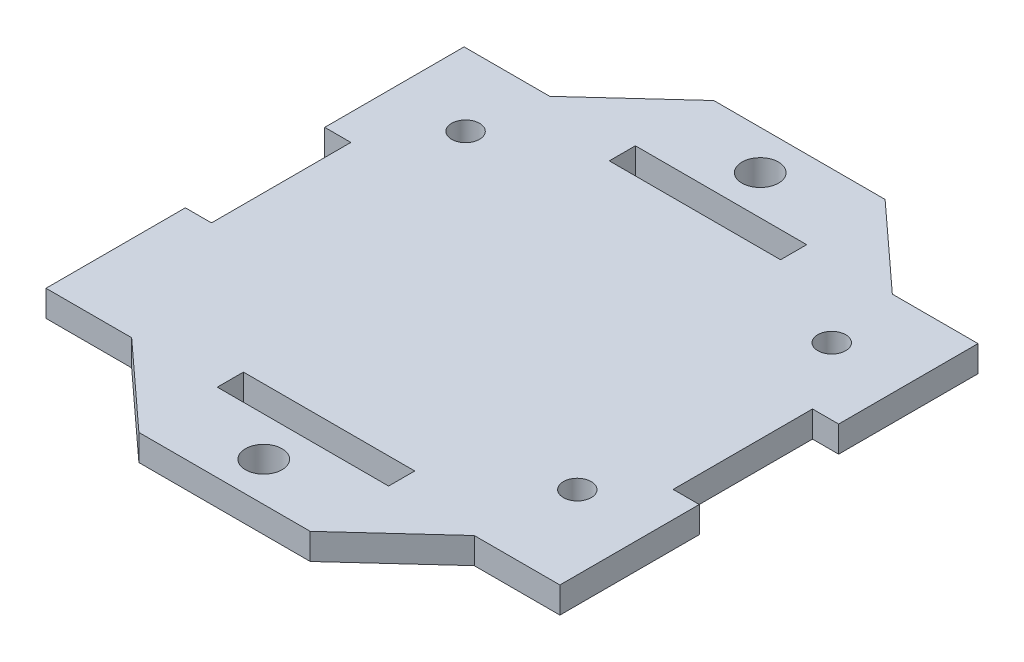
ISO-10303-21;
HEADER;
FILE_DESCRIPTION(('STEP AP214'),'2;1');
FILE_NAME('part.step','',(''),(''),'','','');
FILE_SCHEMA(('AUTOMOTIVE_DESIGN { 1 0 10303 214 1 1 1 1 }'));
ENDSEC;
DATA;
#1=APPLICATION_CONTEXT('core data for automotive mechanical design processes');
#2=APPLICATION_PROTOCOL_DEFINITION('international standard','automotive_design',2000,#1);
#3=PRODUCT_CONTEXT('',#1,'mechanical');
#4=PRODUCT('Part','Part','',(#3));
#5=PRODUCT_RELATED_PRODUCT_CATEGORY('part','',(#4));
#6=PRODUCT_DEFINITION_FORMATION('','',#4);
#7=PRODUCT_DEFINITION_CONTEXT('part definition',#1,'design');
#8=PRODUCT_DEFINITION('design','',#6,#7);
#9=PRODUCT_DEFINITION_SHAPE('','',#8);
#10=(LENGTH_UNIT() NAMED_UNIT(*) SI_UNIT(.MILLI.,.METRE.));
#11=(NAMED_UNIT(*) PLANE_ANGLE_UNIT() SI_UNIT($,.RADIAN.));
#12=(NAMED_UNIT(*) SI_UNIT($,.STERADIAN.) SOLID_ANGLE_UNIT());
#13=UNCERTAINTY_MEASURE_WITH_UNIT(LENGTH_MEASURE(1.E-05),#10,'distance_accuracy_value','');
#14=(GEOMETRIC_REPRESENTATION_CONTEXT(3) GLOBAL_UNCERTAINTY_ASSIGNED_CONTEXT((#13)) GLOBAL_UNIT_ASSIGNED_CONTEXT((#10,
#11,#12)) REPRESENTATION_CONTEXT('',''));
#15=CARTESIAN_POINT('',(0.,0.,0.));
#16=DIRECTION('',(0.,0.,1.));
#17=DIRECTION('',(1.,0.,0.));
#18=AXIS2_PLACEMENT_3D('',#15,#16,#17);
#19=CARTESIAN_POINT('',(-29.5,3.,24.));
#20=DIRECTION('',(0.,0.,-1.));
#21=DIRECTION('',(-1.,0.,0.));
#22=AXIS2_PLACEMENT_3D('',#19,#20,#21);
#23=PLANE('',#22);
#24=DIRECTION('',(0.,1.,0.));
#25=VECTOR('',#24,1.);
#26=CARTESIAN_POINT('',(-19.6666666666667,0.,24.));
#27=LINE('',#26,#25);
#28=CARTESIAN_POINT('',(-19.6666666666667,0.,24.));
#29=VERTEX_POINT('',#28);
#30=CARTESIAN_POINT('',(-19.6666666666667,3.,24.));
#31=VERTEX_POINT('',#30);
#32=EDGE_CURVE('E233',#29,#31,#27,.T.);
#33=ORIENTED_EDGE('',*,*,#32,.T.);
#34=DIRECTION('',(1.,0.,0.));
#35=VECTOR('',#34,1.);
#36=CARTESIAN_POINT('',(-29.5,3.,24.));
#37=LINE('',#36,#35);
#38=CARTESIAN_POINT('',(-29.5,3.,24.));
#39=VERTEX_POINT('',#38);
#40=EDGE_CURVE('E362',#39,#31,#37,.T.);
#41=ORIENTED_EDGE('',*,*,#40,.F.);
#42=DIRECTION('',(0.,-1.,0.));
#43=VECTOR('',#42,1.);
#44=CARTESIAN_POINT('',(-29.5,3.,24.));
#45=LINE('',#44,#43);
#46=CARTESIAN_POINT('',(-29.5,0.,24.));
#47=VERTEX_POINT('',#46);
#48=EDGE_CURVE('E245',#39,#47,#45,.T.);
#49=ORIENTED_EDGE('',*,*,#48,.T.);
#50=DIRECTION('',(1.,0.,0.));
#51=VECTOR('',#50,1.);
#52=CARTESIAN_POINT('',(-29.5,0.,24.));
#53=LINE('',#52,#51);
#54=EDGE_CURVE('E224',#47,#29,#53,.T.);
#55=ORIENTED_EDGE('',*,*,#54,.T.);
#56=EDGE_LOOP('',(#33,#41,#49,#55));
#57=FACE_BOUND('',#56,.T.);
#58=ADVANCED_FACE('F32',(#57),#23,.F.);
#59=CARTESIAN_POINT('',(9.83333333333333,3.,24.));
#60=DIRECTION('',(0.,0.,-1.));
#61=DIRECTION('',(-1.,0.,0.));
#62=AXIS2_PLACEMENT_3D('',#59,#60,#61);
#63=PLANE('',#62);
#64=DIRECTION('',(0.,1.,0.));
#65=VECTOR('',#64,1.);
#66=CARTESIAN_POINT('',(19.6666666666667,0.,24.));
#67=LINE('',#66,#65);
#68=CARTESIAN_POINT('',(19.6666666666667,0.,24.));
#69=VERTEX_POINT('',#68);
#70=CARTESIAN_POINT('',(19.6666666666667,3.,24.));
#71=VERTEX_POINT('',#70);
#72=EDGE_CURVE('E47',#69,#71,#67,.T.);
#73=ORIENTED_EDGE('',*,*,#72,.F.);
#74=DIRECTION('',(1.,0.,0.));
#75=VECTOR('',#74,1.);
#76=CARTESIAN_POINT('',(9.83333333333333,0.,24.));
#77=LINE('',#76,#75);
#78=CARTESIAN_POINT('',(29.5,0.,24.));
#79=VERTEX_POINT('',#78);
#80=EDGE_CURVE('E258',#69,#79,#77,.T.);
#81=ORIENTED_EDGE('',*,*,#80,.T.);
#82=DIRECTION('',(0.,-1.,0.));
#83=VECTOR('',#82,1.);
#84=CARTESIAN_POINT('',(29.5,3.,24.));
#85=LINE('',#84,#83);
#86=CARTESIAN_POINT('',(29.5,3.,24.));
#87=VERTEX_POINT('',#86);
#88=EDGE_CURVE('E307',#87,#79,#85,.T.);
#89=ORIENTED_EDGE('',*,*,#88,.F.);
#90=DIRECTION('',(1.,0.,0.));
#91=VECTOR('',#90,1.);
#92=CARTESIAN_POINT('',(9.83333333333333,3.,24.));
#93=LINE('',#92,#91);
#94=EDGE_CURVE('E376',#71,#87,#93,.T.);
#95=ORIENTED_EDGE('',*,*,#94,.F.);
#96=EDGE_LOOP('',(#73,#81,#89,#95));
#97=FACE_BOUND('',#96,.T.);
#98=ADVANCED_FACE('F427',(#97),#63,.F.);
#99=CARTESIAN_POINT('',(0.,3.,0.));
#100=DIRECTION('',(0.,1.,0.));
#101=DIRECTION('',(0.,0.,1.));
#102=AXIS2_PLACEMENT_3D('',#99,#100,#101);
#103=PLANE('',#102);
#104=DIRECTION('',(1.,0.,0.));
#105=VECTOR('',#104,1.);
#106=CARTESIAN_POINT('',(-19.6666666666667,3.,24.));
#107=LINE('',#106,#105);
#108=CARTESIAN_POINT('',(-9.83333333333333,3.,24.));
#109=VERTEX_POINT('',#108);
#110=CARTESIAN_POINT('',(9.83333333333333,3.,24.));
#111=VERTEX_POINT('',#110);
#112=EDGE_CURVE('E464',#109,#111,#107,.T.);
#113=ORIENTED_EDGE('',*,*,#112,.F.);
#114=DIRECTION('',(0.,0.,-1.));
#115=VECTOR('',#114,1.);
#116=CARTESIAN_POINT('',(-9.83333333333333,3.,24.));
#117=LINE('',#116,#115);
#118=CARTESIAN_POINT('',(-9.83333333333333,3.,21.));
#119=VERTEX_POINT('',#118);
#120=EDGE_CURVE('E365',#109,#119,#117,.T.);
#121=ORIENTED_EDGE('',*,*,#120,.T.);
#122=DIRECTION('',(1.,0.,0.));
#123=VECTOR('',#122,1.);
#124=CARTESIAN_POINT('',(-9.83333333333333,3.,21.));
#125=LINE('',#124,#123);
#126=CARTESIAN_POINT('',(9.83333333333333,3.,21.));
#127=VERTEX_POINT('',#126);
#128=EDGE_CURVE('E372',#119,#127,#125,.T.);
#129=ORIENTED_EDGE('',*,*,#128,.T.);
#130=DIRECTION('',(0.,0.,1.));
#131=VECTOR('',#130,1.);
#132=CARTESIAN_POINT('',(9.83333333333333,3.,21.));
#133=LINE('',#132,#131);
#134=EDGE_CURVE('E374',#127,#111,#133,.T.);
#135=ORIENTED_EDGE('',*,*,#134,.T.);
#136=EDGE_LOOP('',(#113,#121,#129,#135));
#137=FACE_BOUND('',#136,.T.);
#138=DIRECTION('',(-0.737672912354375,0.,0.675158258765021));
#139=VECTOR('',#138,1.);
#140=CARTESIAN_POINT('',(-19.6666666666667,3.,-24.));
#141=LINE('',#140,#139);
#142=CARTESIAN_POINT('',(-9.83333333333333,3.,-33.));
#143=VERTEX_POINT('',#142);
#144=CARTESIAN_POINT('',(-19.6666666666667,3.,-24.));
#145=VERTEX_POINT('',#144);
#146=EDGE_CURVE('E494',#143,#145,#141,.T.);
#147=ORIENTED_EDGE('',*,*,#146,.T.);
#148=DIRECTION('',(-1.,0.,0.));
#149=VECTOR('',#148,1.);
#150=CARTESIAN_POINT('',(-9.83333333333333,3.,-24.));
#151=LINE('',#150,#149);
#152=CARTESIAN_POINT('',(-29.5,3.,-24.));
#153=VERTEX_POINT('',#152);
#154=EDGE_CURVE('E55',#145,#153,#151,.T.);
#155=ORIENTED_EDGE('',*,*,#154,.T.);
#156=DIRECTION('',(0.,0.,1.));
#157=VECTOR('',#156,1.);
#158=CARTESIAN_POINT('',(-29.5,3.,-24.));
#159=LINE('',#158,#157);
#160=CARTESIAN_POINT('',(-29.5,3.,-8.));
#161=VERTEX_POINT('',#160);
#162=EDGE_CURVE('E409',#153,#161,#159,.T.);
#163=ORIENTED_EDGE('',*,*,#162,.T.);
#164=DIRECTION('',(1.,0.,0.));
#165=VECTOR('',#164,1.);
#166=CARTESIAN_POINT('',(-29.5,3.,-8.));
#167=LINE('',#166,#165);
#168=CARTESIAN_POINT('',(-26.5,3.,-8.));
#169=VERTEX_POINT('',#168);
#170=EDGE_CURVE('E339',#161,#169,#167,.T.);
#171=ORIENTED_EDGE('',*,*,#170,.T.);
#172=DIRECTION('',(0.,0.,1.));
#173=VECTOR('',#172,1.);
#174=CARTESIAN_POINT('',(-26.5,3.,-8.));
#175=LINE('',#174,#173);
#176=CARTESIAN_POINT('',(-26.5,3.,8.));
#177=VERTEX_POINT('',#176);
#178=EDGE_CURVE('E367',#169,#177,#175,.T.);
#179=ORIENTED_EDGE('',*,*,#178,.T.);
#180=DIRECTION('',(-1.,0.,0.));
#181=VECTOR('',#180,1.);
#182=CARTESIAN_POINT('',(-26.5,3.,8.));
#183=LINE('',#182,#181);
#184=CARTESIAN_POINT('',(-29.5,3.,8.));
#185=VERTEX_POINT('',#184);
#186=EDGE_CURVE('E363',#177,#185,#183,.T.);
#187=ORIENTED_EDGE('',*,*,#186,.T.);
#188=DIRECTION('',(0.,0.,1.));
#189=VECTOR('',#188,1.);
#190=CARTESIAN_POINT('',(-29.5,3.,8.));
#191=LINE('',#190,#189);
#192=EDGE_CURVE('E360',#185,#39,#191,.T.);
#193=ORIENTED_EDGE('',*,*,#192,.T.);
#194=ORIENTED_EDGE('',*,*,#40,.T.);
#195=DIRECTION('',(-0.737672912354375,0.,-0.675158258765021));
#196=VECTOR('',#195,1.);
#197=CARTESIAN_POINT('',(-19.6666666666667,3.,24.));
#198=LINE('',#197,#196);
#199=CARTESIAN_POINT('',(-9.83333333333333,3.,33.));
#200=VERTEX_POINT('',#199);
#201=EDGE_CURVE('E236',#200,#31,#198,.T.);
#202=ORIENTED_EDGE('',*,*,#201,.F.);
#203=DIRECTION('',(-1.,0.,0.));
#204=VECTOR('',#203,1.);
#205=CARTESIAN_POINT('',(-9.83333333333333,3.,33.));
#206=LINE('',#205,#204);
#207=CARTESIAN_POINT('',(9.83333333333334,3.,33.));
#208=VERTEX_POINT('',#207);
#209=EDGE_CURVE('E468',#208,#200,#206,.T.);
#210=ORIENTED_EDGE('',*,*,#209,.F.);
#211=DIRECTION('',(-0.737672912354375,0.,0.675158258765021));
#212=VECTOR('',#211,1.);
#213=CARTESIAN_POINT('',(9.83333333333334,3.,33.));
#214=LINE('',#213,#212);
#215=EDGE_CURVE('E477',#71,#208,#214,.T.);
#216=ORIENTED_EDGE('',*,*,#215,.F.);
#217=ORIENTED_EDGE('',*,*,#94,.T.);
#218=DIRECTION('',(0.,0.,-1.));
#219=VECTOR('',#218,1.);
#220=CARTESIAN_POINT('',(29.5,3.,24.));
#221=LINE('',#220,#219);
#222=CARTESIAN_POINT('',(29.5,3.,8.));
#223=VERTEX_POINT('',#222);
#224=EDGE_CURVE('E378',#87,#223,#221,.T.);
#225=ORIENTED_EDGE('',*,*,#224,.T.);
#226=DIRECTION('',(-1.,0.,0.));
#227=VECTOR('',#226,1.);
#228=CARTESIAN_POINT('',(29.5,3.,8.));
#229=LINE('',#228,#227);
#230=CARTESIAN_POINT('',(26.5,3.,8.));
#231=VERTEX_POINT('',#230);
#232=EDGE_CURVE('E380',#223,#231,#229,.T.);
#233=ORIENTED_EDGE('',*,*,#232,.T.);
#234=DIRECTION('',(0.,0.,-1.));
#235=VECTOR('',#234,1.);
#236=CARTESIAN_POINT('',(26.5,3.,8.));
#237=LINE('',#236,#235);
#238=CARTESIAN_POINT('',(26.5,3.,-7.99999999999999));
#239=VERTEX_POINT('',#238);
#240=EDGE_CURVE('E382',#231,#239,#237,.T.);
#241=ORIENTED_EDGE('',*,*,#240,.T.);
#242=DIRECTION('',(1.,0.,0.));
#243=VECTOR('',#242,1.);
#244=CARTESIAN_POINT('',(26.5,3.,-7.99999999999999));
#245=LINE('',#244,#243);
#246=CARTESIAN_POINT('',(29.5,3.,-7.99999999999999));
#247=VERTEX_POINT('',#246);
#248=EDGE_CURVE('E384',#239,#247,#245,.T.);
#249=ORIENTED_EDGE('',*,*,#248,.T.);
#250=DIRECTION('',(0.,0.,-1.));
#251=VECTOR('',#250,1.);
#252=CARTESIAN_POINT('',(29.5,3.,-7.99999999999999));
#253=LINE('',#252,#251);
#254=CARTESIAN_POINT('',(29.5,3.,-24.));
#255=VERTEX_POINT('',#254);
#256=EDGE_CURVE('E386',#247,#255,#253,.T.);
#257=ORIENTED_EDGE('',*,*,#256,.T.);
#258=DIRECTION('',(-1.,0.,0.));
#259=VECTOR('',#258,1.);
#260=CARTESIAN_POINT('',(29.5,3.,-24.));
#261=LINE('',#260,#259);
#262=CARTESIAN_POINT('',(19.6666666666667,3.,-24.));
#263=VERTEX_POINT('',#262);
#264=EDGE_CURVE('E388',#255,#263,#261,.T.);
#265=ORIENTED_EDGE('',*,*,#264,.T.);
#266=DIRECTION('',(-0.737672912354375,0.,-0.675158258765021));
#267=VECTOR('',#266,1.);
#268=CARTESIAN_POINT('',(9.83333333333334,3.,-33.));
#269=LINE('',#268,#267);
#270=CARTESIAN_POINT('',(9.83333333333334,3.,-33.));
#271=VERTEX_POINT('',#270);
#272=EDGE_CURVE('E506',#263,#271,#269,.T.);
#273=ORIENTED_EDGE('',*,*,#272,.T.);
#274=DIRECTION('',(-1.,0.,0.));
#275=VECTOR('',#274,1.);
#276=CARTESIAN_POINT('',(-9.83333333333333,3.,-33.));
#277=LINE('',#276,#275);
#278=EDGE_CURVE('E509',#271,#143,#277,.T.);
#279=ORIENTED_EDGE('',*,*,#278,.T.);
#280=EDGE_LOOP('',(#147,#155,#163,#171,#179,#187,#193,#194,#202,#210,#216,#217,#225,#233,#241,
#249,#257,#265,#273,#279));
#281=FACE_BOUND('',#280,.T.);
#282=CARTESIAN_POINT('',(21.0185,3.,-15.69));
#283=DIRECTION('',(0.,1.,0.));
#284=DIRECTION('',(0.,0.,1.));
#285=AXIS2_PLACEMENT_3D('',#282,#283,#284);
#286=CIRCLE('',#285,1.6);
#287=CARTESIAN_POINT('',(21.0185,3.,-14.09));
#288=VERTEX_POINT('',#287);
#289=EDGE_CURVE('E402',#288,#288,#286,.T.);
#290=ORIENTED_EDGE('',*,*,#289,.F.);
#291=EDGE_LOOP('',(#290));
#292=FACE_BOUND('',#291,.T.);
#293=DIRECTION('',(0.,0.,-1.));
#294=VECTOR('',#293,1.);
#295=CARTESIAN_POINT('',(-9.83333333333333,3.,-21.));
#296=LINE('',#295,#294);
#297=CARTESIAN_POINT('',(-9.83333333333333,3.,-21.));
#298=VERTEX_POINT('',#297);
#299=CARTESIAN_POINT('',(-9.83333333333333,3.,-24.));
#300=VERTEX_POINT('',#299);
#301=EDGE_CURVE('E283',#298,#300,#296,.T.);
#302=ORIENTED_EDGE('',*,*,#301,.T.);
#303=DIRECTION('',(1.,0.,0.));
#304=VECTOR('',#303,1.);
#305=CARTESIAN_POINT('',(-19.6666666666667,3.,-24.));
#306=LINE('',#305,#304);
#307=CARTESIAN_POINT('',(9.83333333333334,3.,-24.));
#308=VERTEX_POINT('',#307);
#309=EDGE_CURVE('E488',#300,#308,#306,.T.);
#310=ORIENTED_EDGE('',*,*,#309,.T.);
#311=DIRECTION('',(0.,0.,1.));
#312=VECTOR('',#311,1.);
#313=CARTESIAN_POINT('',(9.83333333333334,3.,-24.));
#314=LINE('',#313,#312);
#315=CARTESIAN_POINT('',(9.83333333333334,3.,-21.));
#316=VERTEX_POINT('',#315);
#317=EDGE_CURVE('E391',#308,#316,#314,.T.);
#318=ORIENTED_EDGE('',*,*,#317,.T.);
#319=DIRECTION('',(-1.,0.,0.));
#320=VECTOR('',#319,1.);
#321=CARTESIAN_POINT('',(9.83333333333334,3.,-21.));
#322=LINE('',#321,#320);
#323=EDGE_CURVE('E393',#316,#298,#322,.T.);
#324=ORIENTED_EDGE('',*,*,#323,.T.);
#325=EDGE_LOOP('',(#302,#310,#318,#324));
#326=FACE_BOUND('',#325,.T.);
#327=CARTESIAN_POINT('',(-21.0185,3.,-15.69));
#328=DIRECTION('',(0.,1.,0.));
#329=DIRECTION('',(0.,0.,1.));
#330=AXIS2_PLACEMENT_3D('',#327,#328,#329);
#331=CIRCLE('',#330,1.6);
#332=CARTESIAN_POINT('',(-21.0185,3.,-14.09));
#333=VERTEX_POINT('',#332);
#334=EDGE_CURVE('E395',#333,#333,#331,.T.);
#335=ORIENTED_EDGE('',*,*,#334,.F.);
#336=EDGE_LOOP('',(#335));
#337=FACE_BOUND('',#336,.T.);
#338=CARTESIAN_POINT('',(21.0185,3.,13.52));
#339=DIRECTION('',(0.,1.,0.));
#340=DIRECTION('',(0.,0.,1.));
#341=AXIS2_PLACEMENT_3D('',#338,#339,#340);
#342=CIRCLE('',#341,1.6);
#343=CARTESIAN_POINT('',(21.0185,3.,15.12));
#344=VERTEX_POINT('',#343);
#345=EDGE_CURVE('E522',#344,#344,#342,.T.);
#346=ORIENTED_EDGE('',*,*,#345,.F.);
#347=EDGE_LOOP('',(#346));
#348=FACE_BOUND('',#347,.T.);
#349=CARTESIAN_POINT('',(0.,3.,-28.5));
#350=DIRECTION('',(0.,1.,0.));
#351=DIRECTION('',(0.,0.,1.));
#352=AXIS2_PLACEMENT_3D('',#349,#350,#351);
#353=CIRCLE('',#352,2.1);
#354=CARTESIAN_POINT('',(0.,3.,-26.4));
#355=VERTEX_POINT('',#354);
#356=EDGE_CURVE('E480',#355,#355,#353,.T.);
#357=ORIENTED_EDGE('',*,*,#356,.F.);
#358=EDGE_LOOP('',(#357));
#359=FACE_BOUND('',#358,.T.);
#360=CARTESIAN_POINT('',(0.,3.,28.5));
#361=DIRECTION('',(0.,-1.,0.));
#362=DIRECTION('',(0.,0.,-1.));
#363=AXIS2_PLACEMENT_3D('',#360,#361,#362);
#364=CIRCLE('',#363,2.1);
#365=CARTESIAN_POINT('',(0.,3.,26.4));
#366=VERTEX_POINT('',#365);
#367=EDGE_CURVE('E471',#366,#366,#364,.T.);
#368=ORIENTED_EDGE('',*,*,#367,.T.);
#369=EDGE_LOOP('',(#368));
#370=FACE_BOUND('',#369,.T.);
#371=ADVANCED_FACE('F413',(#137,#281,#292,#326,#337,#348,#359,#370),#103,.T.);
#372=CARTESIAN_POINT('',(0.,0.,0.));
#373=DIRECTION('',(0.,1.,0.));
#374=DIRECTION('',(0.,0.,1.));
#375=AXIS2_PLACEMENT_3D('',#372,#373,#374);
#376=PLANE('',#375);
#377=DIRECTION('',(0.,0.,-1.));
#378=VECTOR('',#377,1.);
#379=CARTESIAN_POINT('',(-9.83333333333333,0.,24.));
#380=LINE('',#379,#378);
#381=CARTESIAN_POINT('',(-9.83333333333333,0.,24.));
#382=VERTEX_POINT('',#381);
#383=CARTESIAN_POINT('',(-9.83333333333333,0.,21.));
#384=VERTEX_POINT('',#383);
#385=EDGE_CURVE('E246',#382,#384,#380,.T.);
#386=ORIENTED_EDGE('',*,*,#385,.F.);
#387=DIRECTION('',(1.,0.,0.));
#388=VECTOR('',#387,1.);
#389=CARTESIAN_POINT('',(-19.6666666666667,0.,24.));
#390=LINE('',#389,#388);
#391=CARTESIAN_POINT('',(9.83333333333333,0.,24.));
#392=VERTEX_POINT('',#391);
#393=EDGE_CURVE('E230',#382,#392,#390,.T.);
#394=ORIENTED_EDGE('',*,*,#393,.T.);
#395=DIRECTION('',(0.,0.,1.));
#396=VECTOR('',#395,1.);
#397=CARTESIAN_POINT('',(9.83333333333333,0.,21.));
#398=LINE('',#397,#396);
#399=CARTESIAN_POINT('',(9.83333333333333,0.,21.));
#400=VERTEX_POINT('',#399);
#401=EDGE_CURVE('E256',#400,#392,#398,.T.);
#402=ORIENTED_EDGE('',*,*,#401,.F.);
#403=DIRECTION('',(1.,0.,0.));
#404=VECTOR('',#403,1.);
#405=CARTESIAN_POINT('',(-9.83333333333333,0.,21.));
#406=LINE('',#405,#404);
#407=EDGE_CURVE('E249',#384,#400,#406,.T.);
#408=ORIENTED_EDGE('',*,*,#407,.F.);
#409=EDGE_LOOP('',(#386,#394,#402,#408));
#410=FACE_BOUND('',#409,.T.);
#411=DIRECTION('',(-1.,0.,0.));
#412=VECTOR('',#411,1.);
#413=CARTESIAN_POINT('',(-9.83333333333333,0.,-24.));
#414=LINE('',#413,#412);
#415=CARTESIAN_POINT('',(-19.6666666666667,0.,-24.));
#416=VERTEX_POINT('',#415);
#417=CARTESIAN_POINT('',(-29.5,0.,-24.));
#418=VERTEX_POINT('',#417);
#419=EDGE_CURVE('E349',#416,#418,#414,.T.);
#420=ORIENTED_EDGE('',*,*,#419,.F.);
#421=DIRECTION('',(-0.737672912354375,0.,0.675158258765021));
#422=VECTOR('',#421,1.);
#423=CARTESIAN_POINT('',(-19.6666666666667,0.,-24.));
#424=LINE('',#423,#422);
#425=CARTESIAN_POINT('',(-9.83333333333333,0.,-33.));
#426=VERTEX_POINT('',#425);
#427=EDGE_CURVE('E500',#426,#416,#424,.T.);
#428=ORIENTED_EDGE('',*,*,#427,.F.);
#429=DIRECTION('',(-1.,0.,0.));
#430=VECTOR('',#429,1.);
#431=CARTESIAN_POINT('',(-9.83333333333333,0.,-33.));
#432=LINE('',#431,#430);
#433=CARTESIAN_POINT('',(9.83333333333334,0.,-33.));
#434=VERTEX_POINT('',#433);
#435=EDGE_CURVE('E497',#434,#426,#432,.T.);
#436=ORIENTED_EDGE('',*,*,#435,.F.);
#437=DIRECTION('',(-0.737672912354375,0.,-0.675158258765021));
#438=VECTOR('',#437,1.);
#439=CARTESIAN_POINT('',(9.83333333333334,0.,-33.));
#440=LINE('',#439,#438);
#441=CARTESIAN_POINT('',(19.6666666666667,0.,-24.));
#442=VERTEX_POINT('',#441);
#443=EDGE_CURVE('E493',#442,#434,#440,.T.);
#444=ORIENTED_EDGE('',*,*,#443,.F.);
#445=DIRECTION('',(-1.,0.,0.));
#446=VECTOR('',#445,1.);
#447=CARTESIAN_POINT('',(29.5,0.,-24.));
#448=LINE('',#447,#446);
#449=CARTESIAN_POINT('',(29.5,0.,-24.));
#450=VERTEX_POINT('',#449);
#451=EDGE_CURVE('E270',#450,#442,#448,.T.);
#452=ORIENTED_EDGE('',*,*,#451,.F.);
#453=DIRECTION('',(0.,0.,-1.));
#454=VECTOR('',#453,1.);
#455=CARTESIAN_POINT('',(29.5,0.,-7.99999999999999));
#456=LINE('',#455,#454);
#457=CARTESIAN_POINT('',(29.5,0.,-7.99999999999999));
#458=VERTEX_POINT('',#457);
#459=EDGE_CURVE('E268',#458,#450,#456,.T.);
#460=ORIENTED_EDGE('',*,*,#459,.F.);
#461=DIRECTION('',(1.,0.,0.));
#462=VECTOR('',#461,1.);
#463=CARTESIAN_POINT('',(26.5,0.,-7.99999999999999));
#464=LINE('',#463,#462);
#465=CARTESIAN_POINT('',(26.5,0.,-7.99999999999999));
#466=VERTEX_POINT('',#465);
#467=EDGE_CURVE('E266',#466,#458,#464,.T.);
#468=ORIENTED_EDGE('',*,*,#467,.F.);
#469=DIRECTION('',(0.,0.,-1.));
#470=VECTOR('',#469,1.);
#471=CARTESIAN_POINT('',(26.5,0.,8.));
#472=LINE('',#471,#470);
#473=CARTESIAN_POINT('',(26.5,0.,8.));
#474=VERTEX_POINT('',#473);
#475=EDGE_CURVE('E264',#474,#466,#472,.T.);
#476=ORIENTED_EDGE('',*,*,#475,.F.);
#477=DIRECTION('',(-1.,0.,0.));
#478=VECTOR('',#477,1.);
#479=CARTESIAN_POINT('',(29.5,0.,8.));
#480=LINE('',#479,#478);
#481=CARTESIAN_POINT('',(29.5,0.,8.));
#482=VERTEX_POINT('',#481);
#483=EDGE_CURVE('E262',#482,#474,#480,.T.);
#484=ORIENTED_EDGE('',*,*,#483,.F.);
#485=DIRECTION('',(0.,0.,-1.));
#486=VECTOR('',#485,1.);
#487=CARTESIAN_POINT('',(29.5,0.,24.));
#488=LINE('',#487,#486);
#489=EDGE_CURVE('E260',#79,#482,#488,.T.);
#490=ORIENTED_EDGE('',*,*,#489,.F.);
#491=ORIENTED_EDGE('',*,*,#80,.F.);
#492=DIRECTION('',(-0.737672912354375,0.,0.675158258765021));
#493=VECTOR('',#492,1.);
#494=CARTESIAN_POINT('',(9.83333333333334,0.,33.));
#495=LINE('',#494,#493);
#496=CARTESIAN_POINT('',(9.83333333333334,0.,33.));
#497=VERTEX_POINT('',#496);
#498=EDGE_CURVE('E241',#69,#497,#495,.T.);
#499=ORIENTED_EDGE('',*,*,#498,.T.);
#500=DIRECTION('',(-1.,0.,0.));
#501=VECTOR('',#500,1.);
#502=CARTESIAN_POINT('',(-9.83333333333333,0.,33.));
#503=LINE('',#502,#501);
#504=CARTESIAN_POINT('',(-9.83333333333333,0.,33.));
#505=VERTEX_POINT('',#504);
#506=EDGE_CURVE('E226',#497,#505,#503,.T.);
#507=ORIENTED_EDGE('',*,*,#506,.T.);
#508=DIRECTION('',(-0.737672912354375,0.,-0.675158258765021));
#509=VECTOR('',#508,1.);
#510=CARTESIAN_POINT('',(-19.6666666666667,0.,24.));
#511=LINE('',#510,#509);
#512=EDGE_CURVE('E217',#505,#29,#511,.T.);
#513=ORIENTED_EDGE('',*,*,#512,.T.);
#514=ORIENTED_EDGE('',*,*,#54,.F.);
#515=DIRECTION('',(0.,0.,1.));
#516=VECTOR('',#515,1.);
#517=CARTESIAN_POINT('',(-29.5,0.,8.));
#518=LINE('',#517,#516);
#519=CARTESIAN_POINT('',(-29.5,0.,8.));
#520=VERTEX_POINT('',#519);
#521=EDGE_CURVE('E247',#520,#47,#518,.T.);
#522=ORIENTED_EDGE('',*,*,#521,.F.);
#523=DIRECTION('',(-1.,0.,0.));
#524=VECTOR('',#523,1.);
#525=CARTESIAN_POINT('',(-26.5,0.,8.));
#526=LINE('',#525,#524);
#527=CARTESIAN_POINT('',(-26.5,0.,8.));
#528=VERTEX_POINT('',#527);
#529=EDGE_CURVE('E251',#528,#520,#526,.T.);
#530=ORIENTED_EDGE('',*,*,#529,.F.);
#531=DIRECTION('',(0.,0.,1.));
#532=VECTOR('',#531,1.);
#533=CARTESIAN_POINT('',(-26.5,0.,-8.));
#534=LINE('',#533,#532);
#535=CARTESIAN_POINT('',(-26.5,0.,-8.));
#536=VERTEX_POINT('',#535);
#537=EDGE_CURVE('E346',#536,#528,#534,.T.);
#538=ORIENTED_EDGE('',*,*,#537,.F.);
#539=DIRECTION('',(1.,0.,0.));
#540=VECTOR('',#539,1.);
#541=CARTESIAN_POINT('',(-29.5,0.,-8.));
#542=LINE('',#541,#540);
#543=CARTESIAN_POINT('',(-29.5,0.,-8.));
#544=VERTEX_POINT('',#543);
#545=EDGE_CURVE('E338',#544,#536,#542,.T.);
#546=ORIENTED_EDGE('',*,*,#545,.F.);
#547=DIRECTION('',(0.,0.,1.));
#548=VECTOR('',#547,1.);
#549=CARTESIAN_POINT('',(-29.5,0.,-24.));
#550=LINE('',#549,#548);
#551=EDGE_CURVE('E344',#418,#544,#550,.T.);
#552=ORIENTED_EDGE('',*,*,#551,.F.);
#553=EDGE_LOOP('',(#420,#428,#436,#444,#452,#460,#468,#476,#484,#490,#491,#499,#507,#513,#514,
#522,#530,#538,#546,#552));
#554=FACE_BOUND('',#553,.T.);
#555=DIRECTION('',(1.,0.,0.));
#556=VECTOR('',#555,1.);
#557=CARTESIAN_POINT('',(-19.6666666666667,0.,-24.));
#558=LINE('',#557,#556);
#559=CARTESIAN_POINT('',(-9.83333333333333,0.,-24.));
#560=VERTEX_POINT('',#559);
#561=CARTESIAN_POINT('',(9.83333333333334,0.,-24.));
#562=VERTEX_POINT('',#561);
#563=EDGE_CURVE('E491',#560,#562,#558,.T.);
#564=ORIENTED_EDGE('',*,*,#563,.F.);
#565=DIRECTION('',(0.,0.,-1.));
#566=VECTOR('',#565,1.);
#567=CARTESIAN_POINT('',(-9.83333333333333,0.,-21.));
#568=LINE('',#567,#566);
#569=CARTESIAN_POINT('',(-9.83333333333333,0.,-21.));
#570=VERTEX_POINT('',#569);
#571=EDGE_CURVE('E277',#570,#560,#568,.T.);
#572=ORIENTED_EDGE('',*,*,#571,.F.);
#573=DIRECTION('',(-1.,0.,0.));
#574=VECTOR('',#573,1.);
#575=CARTESIAN_POINT('',(9.83333333333334,0.,-21.));
#576=LINE('',#575,#574);
#577=CARTESIAN_POINT('',(9.83333333333334,0.,-21.));
#578=VERTEX_POINT('',#577);
#579=EDGE_CURVE('E275',#578,#570,#576,.T.);
#580=ORIENTED_EDGE('',*,*,#579,.F.);
#581=DIRECTION('',(0.,0.,1.));
#582=VECTOR('',#581,1.);
#583=CARTESIAN_POINT('',(9.83333333333334,0.,-24.));
#584=LINE('',#583,#582);
#585=EDGE_CURVE('E273',#562,#578,#584,.T.);
#586=ORIENTED_EDGE('',*,*,#585,.F.);
#587=EDGE_LOOP('',(#564,#572,#580,#586));
#588=FACE_BOUND('',#587,.T.);
#589=CARTESIAN_POINT('',(-21.0185,0.,-15.69));
#590=DIRECTION('',(0.,1.,0.));
#591=DIRECTION('',(0.,0.,1.));
#592=AXIS2_PLACEMENT_3D('',#589,#590,#591);
#593=CIRCLE('',#592,1.6);
#594=CARTESIAN_POINT('',(-21.0185,0.,-14.09));
#595=VERTEX_POINT('',#594);
#596=EDGE_CURVE('E397',#595,#595,#593,.T.);
#597=ORIENTED_EDGE('',*,*,#596,.T.);
#598=EDGE_LOOP('',(#597));
#599=FACE_BOUND('',#598,.T.);
#600=CARTESIAN_POINT('',(21.0185,0.,-15.69));
#601=DIRECTION('',(0.,1.,0.));
#602=DIRECTION('',(0.,0.,1.));
#603=AXIS2_PLACEMENT_3D('',#600,#601,#602);
#604=CIRCLE('',#603,1.6);
#605=CARTESIAN_POINT('',(21.0185,0.,-14.09));
#606=VERTEX_POINT('',#605);
#607=EDGE_CURVE('E405',#606,#606,#604,.T.);
#608=ORIENTED_EDGE('',*,*,#607,.T.);
#609=EDGE_LOOP('',(#608));
#610=FACE_BOUND('',#609,.T.);
#611=CARTESIAN_POINT('',(21.0185,0.,13.52));
#612=DIRECTION('',(0.,1.,0.));
#613=DIRECTION('',(0.,0.,1.));
#614=AXIS2_PLACEMENT_3D('',#611,#612,#613);
#615=CIRCLE('',#614,1.6);
#616=CARTESIAN_POINT('',(21.0185,0.,15.12));
#617=VERTEX_POINT('',#616);
#618=EDGE_CURVE('E515',#617,#617,#615,.T.);
#619=ORIENTED_EDGE('',*,*,#618,.T.);
#620=EDGE_LOOP('',(#619));
#621=FACE_BOUND('',#620,.T.);
#622=CARTESIAN_POINT('',(0.,0.,-28.5));
#623=DIRECTION('',(0.,1.,0.));
#624=DIRECTION('',(0.,0.,1.));
#625=AXIS2_PLACEMENT_3D('',#622,#623,#624);
#626=CIRCLE('',#625,2.1);
#627=CARTESIAN_POINT('',(0.,0.,-26.4));
#628=VERTEX_POINT('',#627);
#629=EDGE_CURVE('E485',#628,#628,#626,.T.);
#630=ORIENTED_EDGE('',*,*,#629,.T.);
#631=EDGE_LOOP('',(#630));
#632=FACE_BOUND('',#631,.T.);
#633=CARTESIAN_POINT('',(0.,0.,28.5));
#634=DIRECTION('',(0.,-1.,0.));
#635=DIRECTION('',(0.,0.,-1.));
#636=AXIS2_PLACEMENT_3D('',#633,#634,#635);
#637=CIRCLE('',#636,2.1);
#638=CARTESIAN_POINT('',(0.,0.,26.4));
#639=VERTEX_POINT('',#638);
#640=EDGE_CURVE('E466',#639,#639,#637,.T.);
#641=ORIENTED_EDGE('',*,*,#640,.F.);
#642=EDGE_LOOP('',(#641));
#643=FACE_BOUND('',#642,.T.);
#644=ADVANCED_FACE('F220',(#410,#554,#588,#599,#610,#621,#632,#643),#376,.F.);
#645=CARTESIAN_POINT('',(-9.83333333333333,3.,-24.));
#646=DIRECTION('',(0.,0.,1.));
#647=DIRECTION('',(1.,0.,0.));
#648=AXIS2_PLACEMENT_3D('',#645,#646,#647);
#649=PLANE('',#648);
#650=ORIENTED_EDGE('',*,*,#154,.F.);
#651=DIRECTION('',(0.,1.,0.));
#652=VECTOR('',#651,1.);
#653=CARTESIAN_POINT('',(-19.6666666666667,0.,-24.));
#654=LINE('',#653,#652);
#655=EDGE_CURVE('E513',#416,#145,#654,.T.);
#656=ORIENTED_EDGE('',*,*,#655,.F.);
#657=ORIENTED_EDGE('',*,*,#419,.T.);
#658=DIRECTION('',(0.,-1.,0.));
#659=VECTOR('',#658,1.);
#660=CARTESIAN_POINT('',(-29.5,3.,-24.));
#661=LINE('',#660,#659);
#662=EDGE_CURVE('E11',#153,#418,#661,.T.);
#663=ORIENTED_EDGE('',*,*,#662,.F.);
#664=EDGE_LOOP('',(#650,#656,#657,#663));
#665=FACE_BOUND('',#664,.T.);
#666=ADVANCED_FACE('F34',(#665),#649,.F.);
#667=CARTESIAN_POINT('',(-29.5,3.,-24.));
#668=DIRECTION('',(1.,0.,0.));
#669=DIRECTION('',(0.,0.,-1.));
#670=AXIS2_PLACEMENT_3D('',#667,#668,#669);
#671=PLANE('',#670);
#672=ORIENTED_EDGE('',*,*,#551,.T.);
#673=DIRECTION('',(0.,-1.,0.));
#674=VECTOR('',#673,1.);
#675=CARTESIAN_POINT('',(-29.5,3.,-8.));
#676=LINE('',#675,#674);
#677=EDGE_CURVE('E40',#161,#544,#676,.T.);
#678=ORIENTED_EDGE('',*,*,#677,.F.);
#679=ORIENTED_EDGE('',*,*,#162,.F.);
#680=ORIENTED_EDGE('',*,*,#662,.T.);
#681=EDGE_LOOP('',(#672,#678,#679,#680));
#682=FACE_BOUND('',#681,.T.);
#683=ADVANCED_FACE('F424',(#682),#671,.F.);
#684=CARTESIAN_POINT('',(-29.5,3.,-8.));
#685=DIRECTION('',(0.,0.,-1.));
#686=DIRECTION('',(-1.,0.,0.));
#687=AXIS2_PLACEMENT_3D('',#684,#685,#686);
#688=PLANE('',#687);
#689=ORIENTED_EDGE('',*,*,#545,.T.);
#690=DIRECTION('',(0.,-1.,0.));
#691=VECTOR('',#690,1.);
#692=CARTESIAN_POINT('',(-26.5,3.,-8.));
#693=LINE('',#692,#691);
#694=EDGE_CURVE('E329',#169,#536,#693,.T.);
#695=ORIENTED_EDGE('',*,*,#694,.F.);
#696=ORIENTED_EDGE('',*,*,#170,.F.);
#697=ORIENTED_EDGE('',*,*,#677,.T.);
#698=EDGE_LOOP('',(#689,#695,#696,#697));
#699=FACE_BOUND('',#698,.T.);
#700=ADVANCED_FACE('F336',(#699),#688,.F.);
#701=CARTESIAN_POINT('',(-26.5,3.,-8.));
#702=DIRECTION('',(1.,0.,0.));
#703=DIRECTION('',(0.,0.,-1.));
#704=AXIS2_PLACEMENT_3D('',#701,#702,#703);
#705=PLANE('',#704);
#706=ORIENTED_EDGE('',*,*,#537,.T.);
#707=DIRECTION('',(0.,-1.,0.));
#708=VECTOR('',#707,1.);
#709=CARTESIAN_POINT('',(-26.5,3.,8.));
#710=LINE('',#709,#708);
#711=EDGE_CURVE('E326',#177,#528,#710,.T.);
#712=ORIENTED_EDGE('',*,*,#711,.F.);
#713=ORIENTED_EDGE('',*,*,#178,.F.);
#714=ORIENTED_EDGE('',*,*,#694,.T.);
#715=EDGE_LOOP('',(#706,#712,#713,#714));
#716=FACE_BOUND('',#715,.T.);
#717=ADVANCED_FACE('F416',(#716),#705,.F.);
#718=CARTESIAN_POINT('',(-26.5,3.,8.));
#719=DIRECTION('',(0.,0.,1.));
#720=DIRECTION('',(1.,0.,0.));
#721=AXIS2_PLACEMENT_3D('',#718,#719,#720);
#722=PLANE('',#721);
#723=ORIENTED_EDGE('',*,*,#529,.T.);
#724=DIRECTION('',(0.,-1.,0.));
#725=VECTOR('',#724,1.);
#726=CARTESIAN_POINT('',(-29.5,3.,8.));
#727=LINE('',#726,#725);
#728=EDGE_CURVE('E323',#185,#520,#727,.T.);
#729=ORIENTED_EDGE('',*,*,#728,.F.);
#730=ORIENTED_EDGE('',*,*,#186,.F.);
#731=ORIENTED_EDGE('',*,*,#711,.T.);
#732=EDGE_LOOP('',(#723,#729,#730,#731));
#733=FACE_BOUND('',#732,.T.);
#734=ADVANCED_FACE('F354',(#733),#722,.F.);
#735=CARTESIAN_POINT('',(-29.5,3.,8.));
#736=DIRECTION('',(1.,0.,0.));
#737=DIRECTION('',(0.,0.,-1.));
#738=AXIS2_PLACEMENT_3D('',#735,#736,#737);
#739=PLANE('',#738);
#740=ORIENTED_EDGE('',*,*,#521,.T.);
#741=ORIENTED_EDGE('',*,*,#48,.F.);
#742=ORIENTED_EDGE('',*,*,#192,.F.);
#743=ORIENTED_EDGE('',*,*,#728,.T.);
#744=EDGE_LOOP('',(#740,#741,#742,#743));
#745=FACE_BOUND('',#744,.T.);
#746=ADVANCED_FACE('F359',(#745),#739,.F.);
#747=CARTESIAN_POINT('',(-9.83333333333333,3.,24.));
#748=DIRECTION('',(-1.,0.,0.));
#749=DIRECTION('',(0.,0.,1.));
#750=AXIS2_PLACEMENT_3D('',#747,#748,#749);
#751=PLANE('',#750);
#752=ORIENTED_EDGE('',*,*,#385,.T.);
#753=DIRECTION('',(0.,-1.,0.));
#754=VECTOR('',#753,1.);
#755=CARTESIAN_POINT('',(-9.83333333333333,3.,21.));
#756=LINE('',#755,#754);
#757=EDGE_CURVE('E316',#119,#384,#756,.T.);
#758=ORIENTED_EDGE('',*,*,#757,.F.);
#759=ORIENTED_EDGE('',*,*,#120,.F.);
#760=DIRECTION('',(0.,-1.,0.));
#761=VECTOR('',#760,1.);
#762=CARTESIAN_POINT('',(-9.83333333333333,3.,24.));
#763=LINE('',#762,#761);
#764=EDGE_CURVE('E319',#109,#382,#763,.T.);
#765=ORIENTED_EDGE('',*,*,#764,.T.);
#766=EDGE_LOOP('',(#752,#758,#759,#765));
#767=FACE_BOUND('',#766,.T.);
#768=ADVANCED_FACE('F435',(#767),#751,.F.);
#769=CARTESIAN_POINT('',(-9.83333333333333,3.,21.));
#770=DIRECTION('',(0.,0.,-1.));
#771=DIRECTION('',(-1.,0.,0.));
#772=AXIS2_PLACEMENT_3D('',#769,#770,#771);
#773=PLANE('',#772);
#774=ORIENTED_EDGE('',*,*,#407,.T.);
#775=DIRECTION('',(0.,-1.,0.));
#776=VECTOR('',#775,1.);
#777=CARTESIAN_POINT('',(9.83333333333333,3.,21.));
#778=LINE('',#777,#776);
#779=EDGE_CURVE('E313',#127,#400,#778,.T.);
#780=ORIENTED_EDGE('',*,*,#779,.F.);
#781=ORIENTED_EDGE('',*,*,#128,.F.);
#782=ORIENTED_EDGE('',*,*,#757,.T.);
#783=EDGE_LOOP('',(#774,#780,#781,#782));
#784=FACE_BOUND('',#783,.T.);
#785=ADVANCED_FACE('F441',(#784),#773,.F.);
#786=CARTESIAN_POINT('',(9.83333333333333,3.,21.));
#787=DIRECTION('',(1.,0.,0.));
#788=DIRECTION('',(0.,0.,-1.));
#789=AXIS2_PLACEMENT_3D('',#786,#787,#788);
#790=PLANE('',#789);
#791=ORIENTED_EDGE('',*,*,#401,.T.);
#792=DIRECTION('',(0.,-1.,0.));
#793=VECTOR('',#792,1.);
#794=CARTESIAN_POINT('',(9.83333333333333,3.,24.));
#795=LINE('',#794,#793);
#796=EDGE_CURVE('E310',#111,#392,#795,.T.);
#797=ORIENTED_EDGE('',*,*,#796,.F.);
#798=ORIENTED_EDGE('',*,*,#134,.F.);
#799=ORIENTED_EDGE('',*,*,#779,.T.);
#800=EDGE_LOOP('',(#791,#797,#798,#799));
#801=FACE_BOUND('',#800,.T.);
#802=ADVANCED_FACE('F446',(#801),#790,.F.);
#803=CARTESIAN_POINT('',(29.5,3.,24.));
#804=DIRECTION('',(-1.,0.,0.));
#805=DIRECTION('',(0.,0.,1.));
#806=AXIS2_PLACEMENT_3D('',#803,#804,#805);
#807=PLANE('',#806);
#808=ORIENTED_EDGE('',*,*,#489,.T.);
#809=DIRECTION('',(0.,-1.,0.));
#810=VECTOR('',#809,1.);
#811=CARTESIAN_POINT('',(29.5,3.,8.));
#812=LINE('',#811,#810);
#813=EDGE_CURVE('E304',#223,#482,#812,.T.);
#814=ORIENTED_EDGE('',*,*,#813,.F.);
#815=ORIENTED_EDGE('',*,*,#224,.F.);
#816=ORIENTED_EDGE('',*,*,#88,.T.);
#817=EDGE_LOOP('',(#808,#814,#815,#816));
#818=FACE_BOUND('',#817,.T.);
#819=ADVANCED_FACE('F584',(#818),#807,.F.);
#820=CARTESIAN_POINT('',(29.5,3.,8.));
#821=DIRECTION('',(0.,0.,1.));
#822=DIRECTION('',(1.,0.,0.));
#823=AXIS2_PLACEMENT_3D('',#820,#821,#822);
#824=PLANE('',#823);
#825=ORIENTED_EDGE('',*,*,#483,.T.);
#826=DIRECTION('',(0.,-1.,0.));
#827=VECTOR('',#826,1.);
#828=CARTESIAN_POINT('',(26.5,3.,8.));
#829=LINE('',#828,#827);
#830=EDGE_CURVE('E301',#231,#474,#829,.T.);
#831=ORIENTED_EDGE('',*,*,#830,.F.);
#832=ORIENTED_EDGE('',*,*,#232,.F.);
#833=ORIENTED_EDGE('',*,*,#813,.T.);
#834=EDGE_LOOP('',(#825,#831,#832,#833));
#835=FACE_BOUND('',#834,.T.);
#836=ADVANCED_FACE('F580',(#835),#824,.F.);
#837=CARTESIAN_POINT('',(26.5,3.,8.));
#838=DIRECTION('',(-1.,0.,0.));
#839=DIRECTION('',(0.,0.,1.));
#840=AXIS2_PLACEMENT_3D('',#837,#838,#839);
#841=PLANE('',#840);
#842=ORIENTED_EDGE('',*,*,#475,.T.);
#843=DIRECTION('',(0.,-1.,0.));
#844=VECTOR('',#843,1.);
#845=CARTESIAN_POINT('',(26.5,3.,-7.99999999999999));
#846=LINE('',#845,#844);
#847=EDGE_CURVE('E298',#239,#466,#846,.T.);
#848=ORIENTED_EDGE('',*,*,#847,.F.);
#849=ORIENTED_EDGE('',*,*,#240,.F.);
#850=ORIENTED_EDGE('',*,*,#830,.T.);
#851=EDGE_LOOP('',(#842,#848,#849,#850));
#852=FACE_BOUND('',#851,.T.);
#853=ADVANCED_FACE('F576',(#852),#841,.F.);
#854=CARTESIAN_POINT('',(26.5,3.,-7.99999999999999));
#855=DIRECTION('',(0.,0.,-1.));
#856=DIRECTION('',(-1.,0.,0.));
#857=AXIS2_PLACEMENT_3D('',#854,#855,#856);
#858=PLANE('',#857);
#859=ORIENTED_EDGE('',*,*,#467,.T.);
#860=DIRECTION('',(0.,-1.,0.));
#861=VECTOR('',#860,1.);
#862=CARTESIAN_POINT('',(29.5,3.,-7.99999999999999));
#863=LINE('',#862,#861);
#864=EDGE_CURVE('E295',#247,#458,#863,.T.);
#865=ORIENTED_EDGE('',*,*,#864,.F.);
#866=ORIENTED_EDGE('',*,*,#248,.F.);
#867=ORIENTED_EDGE('',*,*,#847,.T.);
#868=EDGE_LOOP('',(#859,#865,#866,#867));
#869=FACE_BOUND('',#868,.T.);
#870=ADVANCED_FACE('F572',(#869),#858,.F.);
#871=CARTESIAN_POINT('',(29.5,3.,-7.99999999999999));
#872=DIRECTION('',(-1.,0.,0.));
#873=DIRECTION('',(0.,0.,1.));
#874=AXIS2_PLACEMENT_3D('',#871,#872,#873);
#875=PLANE('',#874);
#876=ORIENTED_EDGE('',*,*,#459,.T.);
#877=DIRECTION('',(0.,-1.,0.));
#878=VECTOR('',#877,1.);
#879=CARTESIAN_POINT('',(29.5,3.,-24.));
#880=LINE('',#879,#878);
#881=EDGE_CURVE('E292',#255,#450,#880,.T.);
#882=ORIENTED_EDGE('',*,*,#881,.F.);
#883=ORIENTED_EDGE('',*,*,#256,.F.);
#884=ORIENTED_EDGE('',*,*,#864,.T.);
#885=EDGE_LOOP('',(#876,#882,#883,#884));
#886=FACE_BOUND('',#885,.T.);
#887=ADVANCED_FACE('F568',(#886),#875,.F.);
#888=CARTESIAN_POINT('',(29.5,3.,-24.));
#889=DIRECTION('',(0.,0.,1.));
#890=DIRECTION('',(1.,0.,0.));
#891=AXIS2_PLACEMENT_3D('',#888,#889,#890);
#892=PLANE('',#891);
#893=ORIENTED_EDGE('',*,*,#451,.T.);
#894=DIRECTION('',(0.,1.,0.));
#895=VECTOR('',#894,1.);
#896=CARTESIAN_POINT('',(19.6666666666667,0.,-24.));
#897=LINE('',#896,#895);
#898=EDGE_CURVE('E503',#442,#263,#897,.T.);
#899=ORIENTED_EDGE('',*,*,#898,.T.);
#900=ORIENTED_EDGE('',*,*,#264,.F.);
#901=ORIENTED_EDGE('',*,*,#881,.T.);
#902=EDGE_LOOP('',(#893,#899,#900,#901));
#903=FACE_BOUND('',#902,.T.);
#904=ADVANCED_FACE('F564',(#903),#892,.F.);
#905=CARTESIAN_POINT('',(9.83333333333334,3.,-24.));
#906=DIRECTION('',(1.,0.,0.));
#907=DIRECTION('',(0.,0.,-1.));
#908=AXIS2_PLACEMENT_3D('',#905,#906,#907);
#909=PLANE('',#908);
#910=ORIENTED_EDGE('',*,*,#585,.T.);
#911=DIRECTION('',(0.,-1.,0.));
#912=VECTOR('',#911,1.);
#913=CARTESIAN_POINT('',(9.83333333333334,3.,-21.));
#914=LINE('',#913,#912);
#915=EDGE_CURVE('E286',#316,#578,#914,.T.);
#916=ORIENTED_EDGE('',*,*,#915,.F.);
#917=ORIENTED_EDGE('',*,*,#317,.F.);
#918=DIRECTION('',(0.,-1.,0.));
#919=VECTOR('',#918,1.);
#920=CARTESIAN_POINT('',(9.83333333333334,3.,-24.));
#921=LINE('',#920,#919);
#922=EDGE_CURVE('E289',#308,#562,#921,.T.);
#923=ORIENTED_EDGE('',*,*,#922,.T.);
#924=EDGE_LOOP('',(#910,#916,#917,#923));
#925=FACE_BOUND('',#924,.T.);
#926=ADVANCED_FACE('F560',(#925),#909,.F.);
#927=CARTESIAN_POINT('',(9.83333333333334,3.,-21.));
#928=DIRECTION('',(0.,0.,1.));
#929=DIRECTION('',(1.,0.,0.));
#930=AXIS2_PLACEMENT_3D('',#927,#928,#929);
#931=PLANE('',#930);
#932=ORIENTED_EDGE('',*,*,#579,.T.);
#933=DIRECTION('',(0.,-1.,0.));
#934=VECTOR('',#933,1.);
#935=CARTESIAN_POINT('',(-9.83333333333333,3.,-21.));
#936=LINE('',#935,#934);
#937=EDGE_CURVE('E282',#298,#570,#936,.T.);
#938=ORIENTED_EDGE('',*,*,#937,.F.);
#939=ORIENTED_EDGE('',*,*,#323,.F.);
#940=ORIENTED_EDGE('',*,*,#915,.T.);
#941=EDGE_LOOP('',(#932,#938,#939,#940));
#942=FACE_BOUND('',#941,.T.);
#943=ADVANCED_FACE('F556',(#942),#931,.F.);
#944=CARTESIAN_POINT('',(-9.83333333333333,3.,-21.));
#945=DIRECTION('',(-1.,0.,0.));
#946=DIRECTION('',(0.,0.,1.));
#947=AXIS2_PLACEMENT_3D('',#944,#945,#946);
#948=PLANE('',#947);
#949=ORIENTED_EDGE('',*,*,#571,.T.);
#950=DIRECTION('',(0.,-1.,0.));
#951=VECTOR('',#950,1.);
#952=CARTESIAN_POINT('',(-9.83333333333333,3.,-24.));
#953=LINE('',#952,#951);
#954=EDGE_CURVE('E279',#300,#560,#953,.T.);
#955=ORIENTED_EDGE('',*,*,#954,.F.);
#956=ORIENTED_EDGE('',*,*,#301,.F.);
#957=ORIENTED_EDGE('',*,*,#937,.T.);
#958=EDGE_LOOP('',(#949,#955,#956,#957));
#959=FACE_BOUND('',#958,.T.);
#960=ADVANCED_FACE('F546',(#959),#948,.F.);
#961=CARTESIAN_POINT('',(-21.0185,3.,-15.69));
#962=DIRECTION('',(0.,-1.,0.));
#963=DIRECTION('',(0.,0.,-1.));
#964=AXIS2_PLACEMENT_3D('',#961,#962,#963);
#965=CYLINDRICAL_SURFACE('',#964,1.6);
#966=ORIENTED_EDGE('',*,*,#334,.T.);
#967=EDGE_LOOP('',(#966));
#968=FACE_BOUND('',#967,.T.);
#969=ORIENTED_EDGE('',*,*,#596,.F.);
#970=EDGE_LOOP('',(#969));
#971=FACE_BOUND('',#970,.T.);
#972=ADVANCED_FACE('F537',(#968,#971),#965,.F.);
#973=CARTESIAN_POINT('',(21.0185,3.,-15.69));
#974=DIRECTION('',(0.,-1.,0.));
#975=DIRECTION('',(0.,0.,-1.));
#976=AXIS2_PLACEMENT_3D('',#973,#974,#975);
#977=CYLINDRICAL_SURFACE('',#976,1.6);
#978=ORIENTED_EDGE('',*,*,#289,.T.);
#979=EDGE_LOOP('',(#978));
#980=FACE_BOUND('',#979,.T.);
#981=ORIENTED_EDGE('',*,*,#607,.F.);
#982=EDGE_LOOP('',(#981));
#983=FACE_BOUND('',#982,.T.);
#984=ADVANCED_FACE('F534',(#980,#983),#977,.F.);
#985=CARTESIAN_POINT('',(21.0185,3.,13.52));
#986=DIRECTION('',(0.,-1.,0.));
#987=DIRECTION('',(0.,0.,-1.));
#988=AXIS2_PLACEMENT_3D('',#985,#986,#987);
#989=CYLINDRICAL_SURFACE('',#988,1.6);
#990=ORIENTED_EDGE('',*,*,#345,.T.);
#991=EDGE_LOOP('',(#990));
#992=FACE_BOUND('',#991,.T.);
#993=ORIENTED_EDGE('',*,*,#618,.F.);
#994=EDGE_LOOP('',(#993));
#995=FACE_BOUND('',#994,.T.);
#996=ADVANCED_FACE('F536',(#992,#995),#989,.F.);
#997=CARTESIAN_POINT('',(-19.6666666666667,0.,-24.));
#998=DIRECTION('',(0.,0.,1.));
#999=DIRECTION('',(1.,0.,0.));
#1000=AXIS2_PLACEMENT_3D('',#997,#998,#999);
#1001=PLANE('',#1000);
#1002=ORIENTED_EDGE('',*,*,#922,.F.);
#1003=ORIENTED_EDGE('',*,*,#309,.F.);
#1004=ORIENTED_EDGE('',*,*,#954,.T.);
#1005=ORIENTED_EDGE('',*,*,#563,.T.);
#1006=EDGE_LOOP('',(#1002,#1003,#1004,#1005));
#1007=FACE_BOUND('',#1006,.T.);
#1008=ADVANCED_FACE('F543',(#1007),#1001,.T.);
#1009=CARTESIAN_POINT('',(-19.6666666666667,0.,-24.));
#1010=DIRECTION('',(-0.675158258765021,0.,-0.737672912354375));
#1011=DIRECTION('',(-0.737672912354375,0.,0.675158258765021));
#1012=AXIS2_PLACEMENT_3D('',#1009,#1010,#1011);
#1013=PLANE('',#1012);
#1014=ORIENTED_EDGE('',*,*,#146,.F.);
#1015=DIRECTION('',(0.,1.,0.));
#1016=VECTOR('',#1015,1.);
#1017=CARTESIAN_POINT('',(-9.83333333333333,0.,-33.));
#1018=LINE('',#1017,#1016);
#1019=EDGE_CURVE('E516',#426,#143,#1018,.T.);
#1020=ORIENTED_EDGE('',*,*,#1019,.F.);
#1021=ORIENTED_EDGE('',*,*,#427,.T.);
#1022=ORIENTED_EDGE('',*,*,#655,.T.);
#1023=EDGE_LOOP('',(#1014,#1020,#1021,#1022));
#1024=FACE_BOUND('',#1023,.T.);
#1025=ADVANCED_FACE('F764',(#1024),#1013,.T.);
#1026=CARTESIAN_POINT('',(-9.83333333333333,0.,-33.));
#1027=DIRECTION('',(0.,0.,-1.));
#1028=DIRECTION('',(-1.,0.,0.));
#1029=AXIS2_PLACEMENT_3D('',#1026,#1027,#1028);
#1030=PLANE('',#1029);
#1031=ORIENTED_EDGE('',*,*,#278,.F.);
#1032=DIRECTION('',(0.,1.,0.));
#1033=VECTOR('',#1032,1.);
#1034=CARTESIAN_POINT('',(9.83333333333334,0.,-33.));
#1035=LINE('',#1034,#1033);
#1036=EDGE_CURVE('E518',#434,#271,#1035,.T.);
#1037=ORIENTED_EDGE('',*,*,#1036,.F.);
#1038=ORIENTED_EDGE('',*,*,#435,.T.);
#1039=ORIENTED_EDGE('',*,*,#1019,.T.);
#1040=EDGE_LOOP('',(#1031,#1037,#1038,#1039));
#1041=FACE_BOUND('',#1040,.T.);
#1042=ADVANCED_FACE('F754',(#1041),#1030,.T.);
#1043=CARTESIAN_POINT('',(9.83333333333334,0.,-33.));
#1044=DIRECTION('',(0.67515825876502,0.,-0.737672912354375));
#1045=DIRECTION('',(-0.737672912354375,0.,-0.675158258765021));
#1046=AXIS2_PLACEMENT_3D('',#1043,#1044,#1045);
#1047=PLANE('',#1046);
#1048=ORIENTED_EDGE('',*,*,#272,.F.);
#1049=ORIENTED_EDGE('',*,*,#898,.F.);
#1050=ORIENTED_EDGE('',*,*,#443,.T.);
#1051=ORIENTED_EDGE('',*,*,#1036,.T.);
#1052=EDGE_LOOP('',(#1048,#1049,#1050,#1051));
#1053=FACE_BOUND('',#1052,.T.);
#1054=ADVANCED_FACE('F743',(#1053),#1047,.T.);
#1055=CARTESIAN_POINT('',(0.,0.,-28.5));
#1056=DIRECTION('',(0.,1.,0.));
#1057=DIRECTION('',(0.,0.,1.));
#1058=AXIS2_PLACEMENT_3D('',#1055,#1056,#1057);
#1059=CYLINDRICAL_SURFACE('',#1058,2.1);
#1060=ORIENTED_EDGE('',*,*,#629,.F.);
#1061=EDGE_LOOP('',(#1060));
#1062=FACE_BOUND('',#1061,.T.);
#1063=ORIENTED_EDGE('',*,*,#356,.T.);
#1064=EDGE_LOOP('',(#1063));
#1065=FACE_BOUND('',#1064,.T.);
#1066=ADVANCED_FACE('F739',(#1062,#1065),#1059,.F.);
#1067=CARTESIAN_POINT('',(-19.6666666666667,0.,24.));
#1068=DIRECTION('',(0.,0.,1.));
#1069=DIRECTION('',(1.,0.,0.));
#1070=AXIS2_PLACEMENT_3D('',#1067,#1068,#1069);
#1071=PLANE('',#1070);
#1072=ORIENTED_EDGE('',*,*,#393,.F.);
#1073=ORIENTED_EDGE('',*,*,#764,.F.);
#1074=ORIENTED_EDGE('',*,*,#112,.T.);
#1075=ORIENTED_EDGE('',*,*,#796,.T.);
#1076=EDGE_LOOP('',(#1072,#1073,#1074,#1075));
#1077=FACE_BOUND('',#1076,.T.);
#1078=ADVANCED_FACE('F462',(#1077),#1071,.F.);
#1079=CARTESIAN_POINT('',(9.83333333333334,0.,33.));
#1080=DIRECTION('',(-0.67515825876502,0.,-0.737672912354375));
#1081=DIRECTION('',(-0.737672912354375,0.,0.675158258765021));
#1082=AXIS2_PLACEMENT_3D('',#1079,#1080,#1081);
#1083=PLANE('',#1082);
#1084=ORIENTED_EDGE('',*,*,#215,.T.);
#1085=DIRECTION('',(0.,1.,0.));
#1086=VECTOR('',#1085,1.);
#1087=CARTESIAN_POINT('',(9.83333333333334,0.,33.));
#1088=LINE('',#1087,#1086);
#1089=EDGE_CURVE('E481',#497,#208,#1088,.T.);
#1090=ORIENTED_EDGE('',*,*,#1089,.F.);
#1091=ORIENTED_EDGE('',*,*,#498,.F.);
#1092=ORIENTED_EDGE('',*,*,#72,.T.);
#1093=EDGE_LOOP('',(#1084,#1090,#1091,#1092));
#1094=FACE_BOUND('',#1093,.T.);
#1095=ADVANCED_FACE('F795',(#1094),#1083,.F.);
#1096=CARTESIAN_POINT('',(-9.83333333333333,0.,33.));
#1097=DIRECTION('',(0.,0.,-1.));
#1098=DIRECTION('',(-1.,0.,0.));
#1099=AXIS2_PLACEMENT_3D('',#1096,#1097,#1098);
#1100=PLANE('',#1099);
#1101=ORIENTED_EDGE('',*,*,#209,.T.);
#1102=DIRECTION('',(0.,1.,0.));
#1103=VECTOR('',#1102,1.);
#1104=CARTESIAN_POINT('',(-9.83333333333333,0.,33.));
#1105=LINE('',#1104,#1103);
#1106=EDGE_CURVE('E240',#505,#200,#1105,.T.);
#1107=ORIENTED_EDGE('',*,*,#1106,.F.);
#1108=ORIENTED_EDGE('',*,*,#506,.F.);
#1109=ORIENTED_EDGE('',*,*,#1089,.T.);
#1110=EDGE_LOOP('',(#1101,#1107,#1108,#1109));
#1111=FACE_BOUND('',#1110,.T.);
#1112=ADVANCED_FACE('F799',(#1111),#1100,.F.);
#1113=CARTESIAN_POINT('',(-19.6666666666667,0.,24.));
#1114=DIRECTION('',(0.675158258765021,0.,-0.737672912354375));
#1115=DIRECTION('',(-0.737672912354375,0.,-0.675158258765021));
#1116=AXIS2_PLACEMENT_3D('',#1113,#1114,#1115);
#1117=PLANE('',#1116);
#1118=ORIENTED_EDGE('',*,*,#201,.T.);
#1119=ORIENTED_EDGE('',*,*,#32,.F.);
#1120=ORIENTED_EDGE('',*,*,#512,.F.);
#1121=ORIENTED_EDGE('',*,*,#1106,.T.);
#1122=EDGE_LOOP('',(#1118,#1119,#1120,#1121));
#1123=FACE_BOUND('',#1122,.T.);
#1124=ADVANCED_FACE('F234',(#1123),#1117,.F.);
#1125=CARTESIAN_POINT('',(0.,0.,28.5));
#1126=DIRECTION('',(0.,1.,0.));
#1127=DIRECTION('',(0.,0.,1.));
#1128=AXIS2_PLACEMENT_3D('',#1125,#1126,#1127);
#1129=CYLINDRICAL_SURFACE('',#1128,2.1);
#1130=ORIENTED_EDGE('',*,*,#640,.T.);
#1131=EDGE_LOOP('',(#1130));
#1132=FACE_BOUND('',#1131,.T.);
#1133=ORIENTED_EDGE('',*,*,#367,.F.);
#1134=EDGE_LOOP('',(#1133));
#1135=FACE_BOUND('',#1134,.T.);
#1136=ADVANCED_FACE('F798',(#1132,#1135),#1129,.F.);
#1137=CLOSED_SHELL('',(#58,#98,#371,#644,#666,#683,#700,#717,#734,#746,#768,#785,#802,#819,#836,
#853,#870,#887,#904,#926,#943,#960,#972,#984,#996,#1008,#1025,#1042,#1054,#1066,#1078,#1095,
#1112,#1124,#1136));
#1138=MANIFOLD_SOLID_BREP('B2',#1137);
#1139=ADVANCED_BREP_SHAPE_REPRESENTATION('',(#18,#1138),#14);
#1140=SHAPE_DEFINITION_REPRESENTATION(#9,#1139);
ENDSEC;
END-ISO-10303-21;
